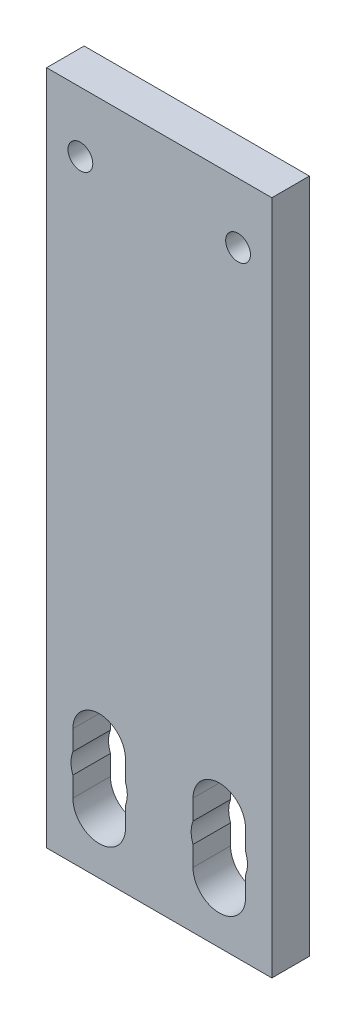
ISO-10303-21;
HEADER;
FILE_DESCRIPTION(('STEP AP214'),'2;1');
FILE_NAME('part.step','',(''),(''),'','','');
FILE_SCHEMA(('AUTOMOTIVE_DESIGN { 1 0 10303 214 1 1 1 1 }'));
ENDSEC;
DATA;
#1=APPLICATION_CONTEXT('core data for automotive mechanical design processes');
#2=APPLICATION_PROTOCOL_DEFINITION('international standard','automotive_design',2000,#1);
#3=PRODUCT_CONTEXT('',#1,'mechanical');
#4=PRODUCT('Part','Part','',(#3));
#5=PRODUCT_RELATED_PRODUCT_CATEGORY('part','',(#4));
#6=PRODUCT_DEFINITION_FORMATION('','',#4);
#7=PRODUCT_DEFINITION_CONTEXT('part definition',#1,'design');
#8=PRODUCT_DEFINITION('design','',#6,#7);
#9=PRODUCT_DEFINITION_SHAPE('','',#8);
#10=(LENGTH_UNIT() NAMED_UNIT(*) SI_UNIT(.MILLI.,.METRE.));
#11=(NAMED_UNIT(*) PLANE_ANGLE_UNIT() SI_UNIT($,.RADIAN.));
#12=(NAMED_UNIT(*) SI_UNIT($,.STERADIAN.) SOLID_ANGLE_UNIT());
#13=UNCERTAINTY_MEASURE_WITH_UNIT(LENGTH_MEASURE(1.E-05),#10,'distance_accuracy_value','');
#14=(GEOMETRIC_REPRESENTATION_CONTEXT(3) GLOBAL_UNCERTAINTY_ASSIGNED_CONTEXT((#13)) GLOBAL_UNIT_ASSIGNED_CONTEXT((#10,
#11,#12)) REPRESENTATION_CONTEXT('',''));
#15=CARTESIAN_POINT('',(0.,0.,0.));
#16=DIRECTION('',(0.,0.,1.));
#17=DIRECTION('',(1.,0.,0.));
#18=AXIS2_PLACEMENT_3D('',#15,#16,#17);
#19=CARTESIAN_POINT('',(0.,0.,2.5));
#20=DIRECTION('',(0.,0.,-1.));
#21=DIRECTION('',(-1.,0.,0.));
#22=AXIS2_PLACEMENT_3D('',#19,#20,#21);
#23=PLANE('',#22);
#24=CARTESIAN_POINT('',(-10.5,82.,2.5));
#25=DIRECTION('',(0.,0.,1.));
#26=DIRECTION('',(1.,0.,0.));
#27=AXIS2_PLACEMENT_3D('',#24,#25,#26);
#28=CIRCLE('',#27,1.65);
#29=CARTESIAN_POINT('',(-8.85,82.,2.5));
#30=VERTEX_POINT('',#29);
#31=EDGE_CURVE('E211',#30,#30,#28,.T.);
#32=ORIENTED_EDGE('',*,*,#31,.F.);
#33=EDGE_LOOP('',(#32));
#34=FACE_BOUND('',#33,.T.);
#35=DIRECTION('',(0.,-1.,0.));
#36=VECTOR('',#35,1.);
#37=CARTESIAN_POINT('',(11.5,0.,2.5));
#38=LINE('',#37,#36);
#39=CARTESIAN_POINT('',(11.5,10.1537087982164,2.5));
#40=VERTEX_POINT('',#39);
#41=CARTESIAN_POINT('',(11.5,7.5,2.5));
#42=VERTEX_POINT('',#41);
#43=EDGE_CURVE('E216',#40,#42,#38,.T.);
#44=ORIENTED_EDGE('',*,*,#43,.T.);
#45=CARTESIAN_POINT('',(8.,7.5,2.5));
#46=DIRECTION('',(0.,0.,-1.));
#47=DIRECTION('',(-1.,0.,0.));
#48=AXIS2_PLACEMENT_3D('',#45,#46,#47);
#49=CIRCLE('',#48,3.5);
#50=CARTESIAN_POINT('',(4.5,7.5,2.5));
#51=VERTEX_POINT('',#50);
#52=EDGE_CURVE('E185',#42,#51,#49,.T.);
#53=ORIENTED_EDGE('',*,*,#52,.T.);
#54=DIRECTION('',(0.,1.,0.));
#55=VECTOR('',#54,1.);
#56=CARTESIAN_POINT('',(4.5,0.,2.5));
#57=LINE('',#56,#55);
#58=CARTESIAN_POINT('',(4.5,10.1537087982164,2.5));
#59=VERTEX_POINT('',#58);
#60=EDGE_CURVE('E248',#51,#59,#57,.T.);
#61=ORIENTED_EDGE('',*,*,#60,.T.);
#62=CARTESIAN_POINT('',(8.,11.5,2.5));
#63=DIRECTION('',(0.,0.,-1.));
#64=DIRECTION('',(-1.,0.,0.));
#65=AXIS2_PLACEMENT_3D('',#62,#63,#64);
#66=CIRCLE('',#65,3.75);
#67=CARTESIAN_POINT('',(4.5,12.8462912017836,2.5));
#68=VERTEX_POINT('',#67);
#69=EDGE_CURVE('E245',#59,#68,#66,.T.);
#70=ORIENTED_EDGE('',*,*,#69,.T.);
#71=DIRECTION('',(0.,1.,0.));
#72=VECTOR('',#71,1.);
#73=CARTESIAN_POINT('',(4.5,0.,2.5));
#74=LINE('',#73,#72);
#75=CARTESIAN_POINT('',(4.5,15.5,2.5));
#76=VERTEX_POINT('',#75);
#77=EDGE_CURVE('E242',#68,#76,#74,.T.);
#78=ORIENTED_EDGE('',*,*,#77,.T.);
#79=CARTESIAN_POINT('',(8.,15.5,2.5));
#80=DIRECTION('',(0.,0.,-1.));
#81=DIRECTION('',(-1.,0.,0.));
#82=AXIS2_PLACEMENT_3D('',#79,#80,#81);
#83=CIRCLE('',#82,3.5);
#84=CARTESIAN_POINT('',(11.5,15.5,2.5));
#85=VERTEX_POINT('',#84);
#86=EDGE_CURVE('E239',#76,#85,#83,.T.);
#87=ORIENTED_EDGE('',*,*,#86,.T.);
#88=DIRECTION('',(0.,-1.,0.));
#89=VECTOR('',#88,1.);
#90=CARTESIAN_POINT('',(11.5,0.,2.5));
#91=LINE('',#90,#89);
#92=CARTESIAN_POINT('',(11.5,12.8462912017836,2.5));
#93=VERTEX_POINT('',#92);
#94=EDGE_CURVE('E236',#85,#93,#91,.T.);
#95=ORIENTED_EDGE('',*,*,#94,.T.);
#96=CARTESIAN_POINT('',(8.,11.5,2.5));
#97=DIRECTION('',(0.,0.,-1.));
#98=DIRECTION('',(-1.,0.,0.));
#99=AXIS2_PLACEMENT_3D('',#96,#97,#98);
#100=CIRCLE('',#99,3.75);
#101=EDGE_CURVE('E233',#93,#40,#100,.T.);
#102=ORIENTED_EDGE('',*,*,#101,.T.);
#103=EDGE_LOOP('',(#44,#53,#61,#70,#78,#87,#95,#102));
#104=FACE_BOUND('',#103,.T.);
#105=DIRECTION('',(0.,1.,0.));
#106=VECTOR('',#105,1.);
#107=CARTESIAN_POINT('',(-11.5,0.,2.5));
#108=LINE('',#107,#106);
#109=CARTESIAN_POINT('',(-11.5,12.8462912017836,2.5));
#110=VERTEX_POINT('',#109);
#111=CARTESIAN_POINT('',(-11.5,15.5,2.5));
#112=VERTEX_POINT('',#111);
#113=EDGE_CURVE('E256',#110,#112,#108,.T.);
#114=ORIENTED_EDGE('',*,*,#113,.T.);
#115=CARTESIAN_POINT('',(-8.,15.5,2.5));
#116=DIRECTION('',(0.,0.,-1.));
#117=DIRECTION('',(-1.,0.,0.));
#118=AXIS2_PLACEMENT_3D('',#115,#116,#117);
#119=CIRCLE('',#118,3.5);
#120=CARTESIAN_POINT('',(-4.5,15.5,2.5));
#121=VERTEX_POINT('',#120);
#122=EDGE_CURVE('E296',#112,#121,#119,.T.);
#123=ORIENTED_EDGE('',*,*,#122,.T.);
#124=DIRECTION('',(0.,-1.,0.));
#125=VECTOR('',#124,1.);
#126=CARTESIAN_POINT('',(-4.5,0.,2.5));
#127=LINE('',#126,#125);
#128=CARTESIAN_POINT('',(-4.5,12.8462912017836,2.5));
#129=VERTEX_POINT('',#128);
#130=EDGE_CURVE('E293',#121,#129,#127,.T.);
#131=ORIENTED_EDGE('',*,*,#130,.T.);
#132=CARTESIAN_POINT('',(-8.,11.5,2.5));
#133=DIRECTION('',(0.,0.,-1.));
#134=DIRECTION('',(-1.,0.,0.));
#135=AXIS2_PLACEMENT_3D('',#132,#133,#134);
#136=CIRCLE('',#135,3.75);
#137=CARTESIAN_POINT('',(-4.5,10.1537087982164,2.5));
#138=VERTEX_POINT('',#137);
#139=EDGE_CURVE('E290',#129,#138,#136,.T.);
#140=ORIENTED_EDGE('',*,*,#139,.T.);
#141=DIRECTION('',(0.,-1.,0.));
#142=VECTOR('',#141,1.);
#143=CARTESIAN_POINT('',(-4.5,0.,2.5));
#144=LINE('',#143,#142);
#145=CARTESIAN_POINT('',(-4.5,7.5,2.5));
#146=VERTEX_POINT('',#145);
#147=EDGE_CURVE('E287',#138,#146,#144,.T.);
#148=ORIENTED_EDGE('',*,*,#147,.T.);
#149=CARTESIAN_POINT('',(-8.,7.5,2.5));
#150=DIRECTION('',(0.,0.,-1.));
#151=DIRECTION('',(-1.,0.,0.));
#152=AXIS2_PLACEMENT_3D('',#149,#150,#151);
#153=CIRCLE('',#152,3.5);
#154=CARTESIAN_POINT('',(-11.5,7.5,2.5));
#155=VERTEX_POINT('',#154);
#156=EDGE_CURVE('E284',#146,#155,#153,.T.);
#157=ORIENTED_EDGE('',*,*,#156,.T.);
#158=DIRECTION('',(0.,1.,0.));
#159=VECTOR('',#158,1.);
#160=CARTESIAN_POINT('',(-11.5,0.,2.5));
#161=LINE('',#160,#159);
#162=CARTESIAN_POINT('',(-11.5,10.1537087982164,2.5));
#163=VERTEX_POINT('',#162);
#164=EDGE_CURVE('E281',#155,#163,#161,.T.);
#165=ORIENTED_EDGE('',*,*,#164,.T.);
#166=CARTESIAN_POINT('',(-8.,11.5,2.5));
#167=DIRECTION('',(0.,0.,-1.));
#168=DIRECTION('',(-1.,0.,0.));
#169=AXIS2_PLACEMENT_3D('',#166,#167,#168);
#170=CIRCLE('',#169,3.75);
#171=EDGE_CURVE('E278',#163,#110,#170,.T.);
#172=ORIENTED_EDGE('',*,*,#171,.T.);
#173=EDGE_LOOP('',(#114,#123,#131,#140,#148,#157,#165,#172));
#174=FACE_BOUND('',#173,.T.);
#175=DIRECTION('',(0.,-1.,0.));
#176=VECTOR('',#175,1.);
#177=CARTESIAN_POINT('',(-15.,0.,2.5));
#178=LINE('',#177,#176);
#179=CARTESIAN_POINT('',(-15.,90.,2.5));
#180=VERTEX_POINT('',#179);
#181=CARTESIAN_POINT('',(-15.,0.,2.5));
#182=VERTEX_POINT('',#181);
#183=EDGE_CURVE('E300',#180,#182,#178,.T.);
#184=ORIENTED_EDGE('',*,*,#183,.T.);
#185=DIRECTION('',(1.,0.,0.));
#186=VECTOR('',#185,1.);
#187=CARTESIAN_POINT('',(-15.,0.,2.5));
#188=LINE('',#187,#186);
#189=CARTESIAN_POINT('',(15.,0.,2.5));
#190=VERTEX_POINT('',#189);
#191=EDGE_CURVE('E303',#182,#190,#188,.T.);
#192=ORIENTED_EDGE('',*,*,#191,.T.);
#193=DIRECTION('',(0.,1.,0.));
#194=VECTOR('',#193,1.);
#195=CARTESIAN_POINT('',(15.,0.,2.5));
#196=LINE('',#195,#194);
#197=CARTESIAN_POINT('',(15.,90.,2.5));
#198=VERTEX_POINT('',#197);
#199=EDGE_CURVE('E306',#190,#198,#196,.T.);
#200=ORIENTED_EDGE('',*,*,#199,.T.);
#201=DIRECTION('',(-1.,0.,0.));
#202=VECTOR('',#201,1.);
#203=CARTESIAN_POINT('',(-15.,90.,2.5));
#204=LINE('',#203,#202);
#205=EDGE_CURVE('E308',#198,#180,#204,.T.);
#206=ORIENTED_EDGE('',*,*,#205,.T.);
#207=EDGE_LOOP('',(#184,#192,#200,#206));
#208=FACE_BOUND('',#207,.T.);
#209=CARTESIAN_POINT('',(10.5,82.,2.5));
#210=DIRECTION('',(0.,0.,1.));
#211=DIRECTION('',(1.,0.,0.));
#212=AXIS2_PLACEMENT_3D('',#209,#210,#211);
#213=CIRCLE('',#212,1.65);
#214=CARTESIAN_POINT('',(12.15,82.,2.5));
#215=VERTEX_POINT('',#214);
#216=EDGE_CURVE('E203',#215,#215,#213,.T.);
#217=ORIENTED_EDGE('',*,*,#216,.F.);
#218=EDGE_LOOP('',(#217));
#219=FACE_BOUND('',#218,.T.);
#220=ADVANCED_FACE('F37',(#34,#104,#174,#208,#219),#23,.F.);
#221=CARTESIAN_POINT('',(-15.,0.,2.5));
#222=DIRECTION('',(1.,0.,0.));
#223=DIRECTION('',(0.,0.,-1.));
#224=AXIS2_PLACEMENT_3D('',#221,#222,#223);
#225=PLANE('',#224);
#226=DIRECTION('',(0.,-1.,0.));
#227=VECTOR('',#226,1.);
#228=CARTESIAN_POINT('',(-15.,0.,-2.5));
#229=LINE('',#228,#227);
#230=CARTESIAN_POINT('',(-15.,90.,-2.5));
#231=VERTEX_POINT('',#230);
#232=CARTESIAN_POINT('',(-15.,0.,-2.5));
#233=VERTEX_POINT('',#232);
#234=EDGE_CURVE('E299',#231,#233,#229,.T.);
#235=ORIENTED_EDGE('',*,*,#234,.T.);
#236=DIRECTION('',(0.,0.,-1.));
#237=VECTOR('',#236,1.);
#238=CARTESIAN_POINT('',(-15.,0.,2.5));
#239=LINE('',#238,#237);
#240=EDGE_CURVE('E326',#182,#233,#239,.T.);
#241=ORIENTED_EDGE('',*,*,#240,.F.);
#242=ORIENTED_EDGE('',*,*,#183,.F.);
#243=DIRECTION('',(0.,0.,-1.));
#244=VECTOR('',#243,1.);
#245=CARTESIAN_POINT('',(-15.,90.,2.5));
#246=LINE('',#245,#244);
#247=EDGE_CURVE('E310',#180,#231,#246,.T.);
#248=ORIENTED_EDGE('',*,*,#247,.T.);
#249=EDGE_LOOP('',(#235,#241,#242,#248));
#250=FACE_BOUND('',#249,.T.);
#251=ADVANCED_FACE('F39',(#250),#225,.F.);
#252=CARTESIAN_POINT('',(-15.,0.,2.5));
#253=DIRECTION('',(0.,1.,0.));
#254=DIRECTION('',(0.,0.,1.));
#255=AXIS2_PLACEMENT_3D('',#252,#253,#254);
#256=PLANE('',#255);
#257=DIRECTION('',(1.,0.,0.));
#258=VECTOR('',#257,1.);
#259=CARTESIAN_POINT('',(-15.,0.,-2.5));
#260=LINE('',#259,#258);
#261=CARTESIAN_POINT('',(15.,0.,-2.5));
#262=VERTEX_POINT('',#261);
#263=EDGE_CURVE('E313',#233,#262,#260,.T.);
#264=ORIENTED_EDGE('',*,*,#263,.T.);
#265=DIRECTION('',(0.,0.,-1.));
#266=VECTOR('',#265,1.);
#267=CARTESIAN_POINT('',(15.,0.,2.5));
#268=LINE('',#267,#266);
#269=EDGE_CURVE('E323',#190,#262,#268,.T.);
#270=ORIENTED_EDGE('',*,*,#269,.F.);
#271=ORIENTED_EDGE('',*,*,#191,.F.);
#272=ORIENTED_EDGE('',*,*,#240,.T.);
#273=EDGE_LOOP('',(#264,#270,#271,#272));
#274=FACE_BOUND('',#273,.T.);
#275=ADVANCED_FACE('F384',(#274),#256,.F.);
#276=CARTESIAN_POINT('',(15.,0.,2.5));
#277=DIRECTION('',(-1.,0.,0.));
#278=DIRECTION('',(0.,0.,1.));
#279=AXIS2_PLACEMENT_3D('',#276,#277,#278);
#280=PLANE('',#279);
#281=DIRECTION('',(0.,1.,0.));
#282=VECTOR('',#281,1.);
#283=CARTESIAN_POINT('',(15.,0.,-2.5));
#284=LINE('',#283,#282);
#285=CARTESIAN_POINT('',(15.,90.,-2.5));
#286=VERTEX_POINT('',#285);
#287=EDGE_CURVE('E315',#262,#286,#284,.T.);
#288=ORIENTED_EDGE('',*,*,#287,.T.);
#289=DIRECTION('',(0.,0.,-1.));
#290=VECTOR('',#289,1.);
#291=CARTESIAN_POINT('',(15.,90.,2.5));
#292=LINE('',#291,#290);
#293=EDGE_CURVE('E320',#198,#286,#292,.T.);
#294=ORIENTED_EDGE('',*,*,#293,.F.);
#295=ORIENTED_EDGE('',*,*,#199,.F.);
#296=ORIENTED_EDGE('',*,*,#269,.T.);
#297=EDGE_LOOP('',(#288,#294,#295,#296));
#298=FACE_BOUND('',#297,.T.);
#299=ADVANCED_FACE('F397',(#298),#280,.F.);
#300=CARTESIAN_POINT('',(-15.,90.,2.5));
#301=DIRECTION('',(0.,-1.,0.));
#302=DIRECTION('',(0.,0.,-1.));
#303=AXIS2_PLACEMENT_3D('',#300,#301,#302);
#304=PLANE('',#303);
#305=DIRECTION('',(-1.,0.,0.));
#306=VECTOR('',#305,1.);
#307=CARTESIAN_POINT('',(-15.,90.,-2.5));
#308=LINE('',#307,#306);
#309=EDGE_CURVE('E304',#286,#231,#308,.T.);
#310=ORIENTED_EDGE('',*,*,#309,.T.);
#311=ORIENTED_EDGE('',*,*,#247,.F.);
#312=ORIENTED_EDGE('',*,*,#205,.F.);
#313=ORIENTED_EDGE('',*,*,#293,.T.);
#314=EDGE_LOOP('',(#310,#311,#312,#313));
#315=FACE_BOUND('',#314,.T.);
#316=ADVANCED_FACE('F393',(#315),#304,.F.);
#317=CARTESIAN_POINT('',(0.,0.,-2.5));
#318=DIRECTION('',(0.,0.,-1.));
#319=DIRECTION('',(-1.,0.,0.));
#320=AXIS2_PLACEMENT_3D('',#317,#318,#319);
#321=PLANE('',#320);
#322=CARTESIAN_POINT('',(-10.5,82.,-2.5));
#323=DIRECTION('',(0.,0.,-1.));
#324=DIRECTION('',(-1.,0.,0.));
#325=AXIS2_PLACEMENT_3D('',#322,#323,#324);
#326=CIRCLE('',#325,1.65);
#327=CARTESIAN_POINT('',(-12.15,82.,-2.5));
#328=VERTEX_POINT('',#327);
#329=EDGE_CURVE('E41',#328,#328,#326,.T.);
#330=ORIENTED_EDGE('',*,*,#329,.F.);
#331=EDGE_LOOP('',(#330));
#332=FACE_BOUND('',#331,.T.);
#333=CARTESIAN_POINT('',(10.5,82.,-2.5));
#334=DIRECTION('',(0.,0.,-1.));
#335=DIRECTION('',(-1.,0.,0.));
#336=AXIS2_PLACEMENT_3D('',#333,#334,#335);
#337=CIRCLE('',#336,1.65);
#338=CARTESIAN_POINT('',(8.85,82.,-2.5));
#339=VERTEX_POINT('',#338);
#340=EDGE_CURVE('E187',#339,#339,#337,.T.);
#341=ORIENTED_EDGE('',*,*,#340,.F.);
#342=EDGE_LOOP('',(#341));
#343=FACE_BOUND('',#342,.T.);
#344=CARTESIAN_POINT('',(8.,7.5,-2.5));
#345=DIRECTION('',(0.,0.,-1.));
#346=DIRECTION('',(-1.,0.,0.));
#347=AXIS2_PLACEMENT_3D('',#344,#345,#346);
#348=CIRCLE('',#347,3.5);
#349=CARTESIAN_POINT('',(11.5,7.5,-2.5));
#350=VERTEX_POINT('',#349);
#351=CARTESIAN_POINT('',(4.5,7.5,-2.5));
#352=VERTEX_POINT('',#351);
#353=EDGE_CURVE('E11',#350,#352,#348,.T.);
#354=ORIENTED_EDGE('',*,*,#353,.F.);
#355=DIRECTION('',(0.,-1.,0.));
#356=VECTOR('',#355,1.);
#357=CARTESIAN_POINT('',(11.5,0.,-2.5));
#358=LINE('',#357,#356);
#359=CARTESIAN_POINT('',(11.5,10.1537087982164,-2.5));
#360=VERTEX_POINT('',#359);
#361=EDGE_CURVE('E172',#360,#350,#358,.T.);
#362=ORIENTED_EDGE('',*,*,#361,.F.);
#363=CARTESIAN_POINT('',(8.,11.5,-2.5));
#364=DIRECTION('',(0.,0.,-1.));
#365=DIRECTION('',(-1.,0.,0.));
#366=AXIS2_PLACEMENT_3D('',#363,#364,#365);
#367=CIRCLE('',#366,3.75);
#368=CARTESIAN_POINT('',(11.5,12.8462912017836,-2.5));
#369=VERTEX_POINT('',#368);
#370=EDGE_CURVE('E177',#369,#360,#367,.T.);
#371=ORIENTED_EDGE('',*,*,#370,.F.);
#372=DIRECTION('',(0.,-1.,0.));
#373=VECTOR('',#372,1.);
#374=CARTESIAN_POINT('',(11.5,0.,-2.5));
#375=LINE('',#374,#373);
#376=CARTESIAN_POINT('',(11.5,15.5,-2.5));
#377=VERTEX_POINT('',#376);
#378=EDGE_CURVE('E346',#377,#369,#375,.T.);
#379=ORIENTED_EDGE('',*,*,#378,.F.);
#380=CARTESIAN_POINT('',(8.,15.5,-2.5));
#381=DIRECTION('',(0.,0.,-1.));
#382=DIRECTION('',(-1.,0.,0.));
#383=AXIS2_PLACEMENT_3D('',#380,#381,#382);
#384=CIRCLE('',#383,3.5);
#385=CARTESIAN_POINT('',(4.5,15.5,-2.5));
#386=VERTEX_POINT('',#385);
#387=EDGE_CURVE('E348',#386,#377,#384,.T.);
#388=ORIENTED_EDGE('',*,*,#387,.F.);
#389=DIRECTION('',(0.,1.,0.));
#390=VECTOR('',#389,1.);
#391=CARTESIAN_POINT('',(4.5,0.,-2.5));
#392=LINE('',#391,#390);
#393=CARTESIAN_POINT('',(4.5,12.8462912017836,-2.5));
#394=VERTEX_POINT('',#393);
#395=EDGE_CURVE('E199',#394,#386,#392,.T.);
#396=ORIENTED_EDGE('',*,*,#395,.F.);
#397=CARTESIAN_POINT('',(8.,11.5,-2.5));
#398=DIRECTION('',(0.,0.,-1.));
#399=DIRECTION('',(-1.,0.,0.));
#400=AXIS2_PLACEMENT_3D('',#397,#398,#399);
#401=CIRCLE('',#400,3.75);
#402=CARTESIAN_POINT('',(4.5,10.1537087982164,-2.5));
#403=VERTEX_POINT('',#402);
#404=EDGE_CURVE('E194',#403,#394,#401,.T.);
#405=ORIENTED_EDGE('',*,*,#404,.F.);
#406=DIRECTION('',(0.,1.,0.));
#407=VECTOR('',#406,1.);
#408=CARTESIAN_POINT('',(4.5,0.,-2.5));
#409=LINE('',#408,#407);
#410=EDGE_CURVE('E46',#352,#403,#409,.T.);
#411=ORIENTED_EDGE('',*,*,#410,.F.);
#412=EDGE_LOOP('',(#354,#362,#371,#379,#388,#396,#405,#411));
#413=FACE_BOUND('',#412,.T.);
#414=CARTESIAN_POINT('',(-8.,15.5,-2.5));
#415=DIRECTION('',(0.,0.,-1.));
#416=DIRECTION('',(-1.,0.,0.));
#417=AXIS2_PLACEMENT_3D('',#414,#415,#416);
#418=CIRCLE('',#417,3.5);
#419=CARTESIAN_POINT('',(-11.5,15.5,-2.5));
#420=VERTEX_POINT('',#419);
#421=CARTESIAN_POINT('',(-4.5,15.5,-2.5));
#422=VERTEX_POINT('',#421);
#423=EDGE_CURVE('E178',#420,#422,#418,.T.);
#424=ORIENTED_EDGE('',*,*,#423,.F.);
#425=DIRECTION('',(0.,1.,0.));
#426=VECTOR('',#425,1.);
#427=CARTESIAN_POINT('',(-11.5,0.,-2.5));
#428=LINE('',#427,#426);
#429=CARTESIAN_POINT('',(-11.5,12.8462912017836,-2.5));
#430=VERTEX_POINT('',#429);
#431=EDGE_CURVE('E329',#430,#420,#428,.T.);
#432=ORIENTED_EDGE('',*,*,#431,.F.);
#433=CARTESIAN_POINT('',(-8.,11.5,-2.5));
#434=DIRECTION('',(0.,0.,-1.));
#435=DIRECTION('',(-1.,0.,0.));
#436=AXIS2_PLACEMENT_3D('',#433,#434,#435);
#437=CIRCLE('',#436,3.75);
#438=CARTESIAN_POINT('',(-11.5,10.1537087982164,-2.5));
#439=VERTEX_POINT('',#438);
#440=EDGE_CURVE('E331',#439,#430,#437,.T.);
#441=ORIENTED_EDGE('',*,*,#440,.F.);
#442=DIRECTION('',(0.,1.,0.));
#443=VECTOR('',#442,1.);
#444=CARTESIAN_POINT('',(-11.5,0.,-2.5));
#445=LINE('',#444,#443);
#446=CARTESIAN_POINT('',(-11.5,7.5,-2.5));
#447=VERTEX_POINT('',#446);
#448=EDGE_CURVE('E334',#447,#439,#445,.T.);
#449=ORIENTED_EDGE('',*,*,#448,.F.);
#450=CARTESIAN_POINT('',(-8.,7.5,-2.5));
#451=DIRECTION('',(0.,0.,-1.));
#452=DIRECTION('',(-1.,0.,0.));
#453=AXIS2_PLACEMENT_3D('',#450,#451,#452);
#454=CIRCLE('',#453,3.5);
#455=CARTESIAN_POINT('',(-4.5,7.5,-2.5));
#456=VERTEX_POINT('',#455);
#457=EDGE_CURVE('E336',#456,#447,#454,.T.);
#458=ORIENTED_EDGE('',*,*,#457,.F.);
#459=DIRECTION('',(0.,-1.,0.));
#460=VECTOR('',#459,1.);
#461=CARTESIAN_POINT('',(-4.5,0.,-2.5));
#462=LINE('',#461,#460);
#463=CARTESIAN_POINT('',(-4.5,10.1537087982164,-2.5));
#464=VERTEX_POINT('',#463);
#465=EDGE_CURVE('E338',#464,#456,#462,.T.);
#466=ORIENTED_EDGE('',*,*,#465,.F.);
#467=CARTESIAN_POINT('',(-8.,11.5,-2.5));
#468=DIRECTION('',(0.,0.,-1.));
#469=DIRECTION('',(-1.,0.,0.));
#470=AXIS2_PLACEMENT_3D('',#467,#468,#469);
#471=CIRCLE('',#470,3.75);
#472=CARTESIAN_POINT('',(-4.5,12.8462912017836,-2.5));
#473=VERTEX_POINT('',#472);
#474=EDGE_CURVE('E340',#473,#464,#471,.T.);
#475=ORIENTED_EDGE('',*,*,#474,.F.);
#476=DIRECTION('',(0.,-1.,0.));
#477=VECTOR('',#476,1.);
#478=CARTESIAN_POINT('',(-4.5,0.,-2.5));
#479=LINE('',#478,#477);
#480=EDGE_CURVE('E342',#422,#473,#479,.T.);
#481=ORIENTED_EDGE('',*,*,#480,.F.);
#482=EDGE_LOOP('',(#424,#432,#441,#449,#458,#466,#475,#481));
#483=FACE_BOUND('',#482,.T.);
#484=ORIENTED_EDGE('',*,*,#234,.F.);
#485=ORIENTED_EDGE('',*,*,#309,.F.);
#486=ORIENTED_EDGE('',*,*,#287,.F.);
#487=ORIENTED_EDGE('',*,*,#263,.F.);
#488=EDGE_LOOP('',(#484,#485,#486,#487));
#489=FACE_BOUND('',#488,.T.);
#490=ADVANCED_FACE('F190',(#332,#343,#413,#483,#489),#321,.T.);
#491=CARTESIAN_POINT('',(-8.,15.5,-5.));
#492=DIRECTION('',(0.,0.,1.));
#493=DIRECTION('',(1.,0.,0.));
#494=AXIS2_PLACEMENT_3D('',#491,#492,#493);
#495=CYLINDRICAL_SURFACE('',#494,3.5);
#496=DIRECTION('',(0.,0.,1.));
#497=VECTOR('',#496,1.);
#498=CARTESIAN_POINT('',(-11.5,15.5,-5.));
#499=LINE('',#498,#497);
#500=EDGE_CURVE('E252',#420,#112,#499,.T.);
#501=ORIENTED_EDGE('',*,*,#500,.F.);
#502=ORIENTED_EDGE('',*,*,#423,.T.);
#503=DIRECTION('',(0.,0.,1.));
#504=VECTOR('',#503,1.);
#505=CARTESIAN_POINT('',(-4.5,15.5,-5.));
#506=LINE('',#505,#504);
#507=EDGE_CURVE('E253',#422,#121,#506,.T.);
#508=ORIENTED_EDGE('',*,*,#507,.T.);
#509=ORIENTED_EDGE('',*,*,#122,.F.);
#510=EDGE_LOOP('',(#501,#502,#508,#509));
#511=FACE_BOUND('',#510,.T.);
#512=ADVANCED_FACE('F389',(#511),#495,.F.);
#513=CARTESIAN_POINT('',(-4.5,12.8462912017836,-5.));
#514=DIRECTION('',(1.,0.,0.));
#515=DIRECTION('',(0.,0.,-1.));
#516=AXIS2_PLACEMENT_3D('',#513,#514,#515);
#517=PLANE('',#516);
#518=ORIENTED_EDGE('',*,*,#507,.F.);
#519=ORIENTED_EDGE('',*,*,#480,.T.);
#520=DIRECTION('',(0.,0.,1.));
#521=VECTOR('',#520,1.);
#522=CARTESIAN_POINT('',(-4.5,12.8462912017836,-5.));
#523=LINE('',#522,#521);
#524=EDGE_CURVE('E257',#473,#129,#523,.T.);
#525=ORIENTED_EDGE('',*,*,#524,.T.);
#526=ORIENTED_EDGE('',*,*,#130,.F.);
#527=EDGE_LOOP('',(#518,#519,#525,#526));
#528=FACE_BOUND('',#527,.T.);
#529=ADVANCED_FACE('F439',(#528),#517,.F.);
#530=CARTESIAN_POINT('',(-8.,11.5,-5.));
#531=DIRECTION('',(0.,0.,1.));
#532=DIRECTION('',(1.,0.,0.));
#533=AXIS2_PLACEMENT_3D('',#530,#531,#532);
#534=CYLINDRICAL_SURFACE('',#533,3.75);
#535=ORIENTED_EDGE('',*,*,#524,.F.);
#536=ORIENTED_EDGE('',*,*,#474,.T.);
#537=DIRECTION('',(0.,0.,1.));
#538=VECTOR('',#537,1.);
#539=CARTESIAN_POINT('',(-4.5,10.1537087982164,-5.));
#540=LINE('',#539,#538);
#541=EDGE_CURVE('E260',#464,#138,#540,.T.);
#542=ORIENTED_EDGE('',*,*,#541,.T.);
#543=ORIENTED_EDGE('',*,*,#139,.F.);
#544=EDGE_LOOP('',(#535,#536,#542,#543));
#545=FACE_BOUND('',#544,.T.);
#546=ADVANCED_FACE('F446',(#545),#534,.F.);
#547=CARTESIAN_POINT('',(-4.5,7.5,-5.));
#548=DIRECTION('',(1.,0.,0.));
#549=DIRECTION('',(0.,0.,-1.));
#550=AXIS2_PLACEMENT_3D('',#547,#548,#549);
#551=PLANE('',#550);
#552=ORIENTED_EDGE('',*,*,#541,.F.);
#553=ORIENTED_EDGE('',*,*,#465,.T.);
#554=DIRECTION('',(0.,0.,1.));
#555=VECTOR('',#554,1.);
#556=CARTESIAN_POINT('',(-4.5,7.5,-5.));
#557=LINE('',#556,#555);
#558=EDGE_CURVE('E263',#456,#146,#557,.T.);
#559=ORIENTED_EDGE('',*,*,#558,.T.);
#560=ORIENTED_EDGE('',*,*,#147,.F.);
#561=EDGE_LOOP('',(#552,#553,#559,#560));
#562=FACE_BOUND('',#561,.T.);
#563=ADVANCED_FACE('F454',(#562),#551,.F.);
#564=CARTESIAN_POINT('',(-8.,7.5,-5.));
#565=DIRECTION('',(0.,0.,1.));
#566=DIRECTION('',(1.,0.,0.));
#567=AXIS2_PLACEMENT_3D('',#564,#565,#566);
#568=CYLINDRICAL_SURFACE('',#567,3.5);
#569=ORIENTED_EDGE('',*,*,#558,.F.);
#570=ORIENTED_EDGE('',*,*,#457,.T.);
#571=DIRECTION('',(0.,0.,1.));
#572=VECTOR('',#571,1.);
#573=CARTESIAN_POINT('',(-11.5,7.5,-5.));
#574=LINE('',#573,#572);
#575=EDGE_CURVE('E266',#447,#155,#574,.T.);
#576=ORIENTED_EDGE('',*,*,#575,.T.);
#577=ORIENTED_EDGE('',*,*,#156,.F.);
#578=EDGE_LOOP('',(#569,#570,#576,#577));
#579=FACE_BOUND('',#578,.T.);
#580=ADVANCED_FACE('F462',(#579),#568,.F.);
#581=CARTESIAN_POINT('',(-11.5,7.5,-5.));
#582=DIRECTION('',(-1.,0.,0.));
#583=DIRECTION('',(0.,0.,1.));
#584=AXIS2_PLACEMENT_3D('',#581,#582,#583);
#585=PLANE('',#584);
#586=ORIENTED_EDGE('',*,*,#575,.F.);
#587=ORIENTED_EDGE('',*,*,#448,.T.);
#588=DIRECTION('',(0.,0.,1.));
#589=VECTOR('',#588,1.);
#590=CARTESIAN_POINT('',(-11.5,10.1537087982164,-5.));
#591=LINE('',#590,#589);
#592=EDGE_CURVE('E269',#439,#163,#591,.T.);
#593=ORIENTED_EDGE('',*,*,#592,.T.);
#594=ORIENTED_EDGE('',*,*,#164,.F.);
#595=EDGE_LOOP('',(#586,#587,#593,#594));
#596=FACE_BOUND('',#595,.T.);
#597=ADVANCED_FACE('F470',(#596),#585,.F.);
#598=CARTESIAN_POINT('',(-8.,11.5,-5.));
#599=DIRECTION('',(0.,0.,1.));
#600=DIRECTION('',(1.,0.,0.));
#601=AXIS2_PLACEMENT_3D('',#598,#599,#600);
#602=CYLINDRICAL_SURFACE('',#601,3.75);
#603=ORIENTED_EDGE('',*,*,#592,.F.);
#604=ORIENTED_EDGE('',*,*,#440,.T.);
#605=DIRECTION('',(0.,0.,1.));
#606=VECTOR('',#605,1.);
#607=CARTESIAN_POINT('',(-11.5,12.8462912017836,-5.));
#608=LINE('',#607,#606);
#609=EDGE_CURVE('E272',#430,#110,#608,.T.);
#610=ORIENTED_EDGE('',*,*,#609,.T.);
#611=ORIENTED_EDGE('',*,*,#171,.F.);
#612=EDGE_LOOP('',(#603,#604,#610,#611));
#613=FACE_BOUND('',#612,.T.);
#614=ADVANCED_FACE('F478',(#613),#602,.F.);
#615=CARTESIAN_POINT('',(-11.5,12.8462912017836,-5.));
#616=DIRECTION('',(-1.,0.,0.));
#617=DIRECTION('',(0.,0.,1.));
#618=AXIS2_PLACEMENT_3D('',#615,#616,#617);
#619=PLANE('',#618);
#620=ORIENTED_EDGE('',*,*,#609,.F.);
#621=ORIENTED_EDGE('',*,*,#431,.T.);
#622=ORIENTED_EDGE('',*,*,#500,.T.);
#623=ORIENTED_EDGE('',*,*,#113,.F.);
#624=EDGE_LOOP('',(#620,#621,#622,#623));
#625=FACE_BOUND('',#624,.T.);
#626=ADVANCED_FACE('F375',(#625),#619,.F.);
#627=CARTESIAN_POINT('',(8.,7.5,-5.));
#628=DIRECTION('',(0.,0.,1.));
#629=DIRECTION('',(1.,0.,0.));
#630=AXIS2_PLACEMENT_3D('',#627,#628,#629);
#631=CYLINDRICAL_SURFACE('',#630,3.5);
#632=DIRECTION('',(0.,0.,1.));
#633=VECTOR('',#632,1.);
#634=CARTESIAN_POINT('',(11.5,7.5,-5.));
#635=LINE('',#634,#633);
#636=EDGE_CURVE('E54',#350,#42,#635,.T.);
#637=ORIENTED_EDGE('',*,*,#636,.F.);
#638=ORIENTED_EDGE('',*,*,#353,.T.);
#639=DIRECTION('',(0.,0.,1.));
#640=VECTOR('',#639,1.);
#641=CARTESIAN_POINT('',(4.5,7.5,-5.));
#642=LINE('',#641,#640);
#643=EDGE_CURVE('E214',#352,#51,#642,.T.);
#644=ORIENTED_EDGE('',*,*,#643,.T.);
#645=ORIENTED_EDGE('',*,*,#52,.F.);
#646=EDGE_LOOP('',(#637,#638,#644,#645));
#647=FACE_BOUND('',#646,.T.);
#648=ADVANCED_FACE('F181',(#647),#631,.F.);
#649=CARTESIAN_POINT('',(4.5,7.5,-5.));
#650=DIRECTION('',(-1.,0.,0.));
#651=DIRECTION('',(0.,0.,1.));
#652=AXIS2_PLACEMENT_3D('',#649,#650,#651);
#653=PLANE('',#652);
#654=ORIENTED_EDGE('',*,*,#643,.F.);
#655=ORIENTED_EDGE('',*,*,#410,.T.);
#656=DIRECTION('',(0.,0.,1.));
#657=VECTOR('',#656,1.);
#658=CARTESIAN_POINT('',(4.5,10.1537087982164,-5.));
#659=LINE('',#658,#657);
#660=EDGE_CURVE('E217',#403,#59,#659,.T.);
#661=ORIENTED_EDGE('',*,*,#660,.T.);
#662=ORIENTED_EDGE('',*,*,#60,.F.);
#663=EDGE_LOOP('',(#654,#655,#661,#662));
#664=FACE_BOUND('',#663,.T.);
#665=ADVANCED_FACE('F367',(#664),#653,.F.);
#666=CARTESIAN_POINT('',(8.,11.5,-5.));
#667=DIRECTION('',(0.,0.,1.));
#668=DIRECTION('',(1.,0.,0.));
#669=AXIS2_PLACEMENT_3D('',#666,#667,#668);
#670=CYLINDRICAL_SURFACE('',#669,3.75);
#671=ORIENTED_EDGE('',*,*,#660,.F.);
#672=ORIENTED_EDGE('',*,*,#404,.T.);
#673=DIRECTION('',(0.,0.,1.));
#674=VECTOR('',#673,1.);
#675=CARTESIAN_POINT('',(4.5,12.8462912017836,-5.));
#676=LINE('',#675,#674);
#677=EDGE_CURVE('E219',#394,#68,#676,.T.);
#678=ORIENTED_EDGE('',*,*,#677,.T.);
#679=ORIENTED_EDGE('',*,*,#69,.F.);
#680=EDGE_LOOP('',(#671,#672,#678,#679));
#681=FACE_BOUND('',#680,.T.);
#682=ADVANCED_FACE('F366',(#681),#670,.F.);
#683=CARTESIAN_POINT('',(4.5,12.8462912017836,-5.));
#684=DIRECTION('',(-1.,0.,0.));
#685=DIRECTION('',(0.,0.,1.));
#686=AXIS2_PLACEMENT_3D('',#683,#684,#685);
#687=PLANE('',#686);
#688=ORIENTED_EDGE('',*,*,#677,.F.);
#689=ORIENTED_EDGE('',*,*,#395,.T.);
#690=DIRECTION('',(0.,0.,1.));
#691=VECTOR('',#690,1.);
#692=CARTESIAN_POINT('',(4.5,15.5,-5.));
#693=LINE('',#692,#691);
#694=EDGE_CURVE('E222',#386,#76,#693,.T.);
#695=ORIENTED_EDGE('',*,*,#694,.T.);
#696=ORIENTED_EDGE('',*,*,#77,.F.);
#697=EDGE_LOOP('',(#688,#689,#695,#696));
#698=FACE_BOUND('',#697,.T.);
#699=ADVANCED_FACE('F352',(#698),#687,.F.);
#700=CARTESIAN_POINT('',(8.,15.5,-5.));
#701=DIRECTION('',(0.,0.,1.));
#702=DIRECTION('',(1.,0.,0.));
#703=AXIS2_PLACEMENT_3D('',#700,#701,#702);
#704=CYLINDRICAL_SURFACE('',#703,3.5);
#705=ORIENTED_EDGE('',*,*,#694,.F.);
#706=ORIENTED_EDGE('',*,*,#387,.T.);
#707=DIRECTION('',(0.,0.,1.));
#708=VECTOR('',#707,1.);
#709=CARTESIAN_POINT('',(11.5,15.5,-5.));
#710=LINE('',#709,#708);
#711=EDGE_CURVE('E225',#377,#85,#710,.T.);
#712=ORIENTED_EDGE('',*,*,#711,.T.);
#713=ORIENTED_EDGE('',*,*,#86,.F.);
#714=EDGE_LOOP('',(#705,#706,#712,#713));
#715=FACE_BOUND('',#714,.T.);
#716=ADVANCED_FACE('F355',(#715),#704,.F.);
#717=CARTESIAN_POINT('',(11.5,12.8462912017836,-5.));
#718=DIRECTION('',(1.,0.,0.));
#719=DIRECTION('',(0.,0.,-1.));
#720=AXIS2_PLACEMENT_3D('',#717,#718,#719);
#721=PLANE('',#720);
#722=ORIENTED_EDGE('',*,*,#711,.F.);
#723=ORIENTED_EDGE('',*,*,#378,.T.);
#724=DIRECTION('',(0.,0.,1.));
#725=VECTOR('',#724,1.);
#726=CARTESIAN_POINT('',(11.5,12.8462912017836,-5.));
#727=LINE('',#726,#725);
#728=EDGE_CURVE('E228',#369,#93,#727,.T.);
#729=ORIENTED_EDGE('',*,*,#728,.T.);
#730=ORIENTED_EDGE('',*,*,#94,.F.);
#731=EDGE_LOOP('',(#722,#723,#729,#730));
#732=FACE_BOUND('',#731,.T.);
#733=ADVANCED_FACE('F360',(#732),#721,.F.);
#734=CARTESIAN_POINT('',(8.,11.5,-5.));
#735=DIRECTION('',(0.,0.,1.));
#736=DIRECTION('',(1.,0.,0.));
#737=AXIS2_PLACEMENT_3D('',#734,#735,#736);
#738=CYLINDRICAL_SURFACE('',#737,3.75);
#739=ORIENTED_EDGE('',*,*,#728,.F.);
#740=ORIENTED_EDGE('',*,*,#370,.T.);
#741=DIRECTION('',(0.,0.,1.));
#742=VECTOR('',#741,1.);
#743=CARTESIAN_POINT('',(11.5,10.1537087982164,-5.));
#744=LINE('',#743,#742);
#745=EDGE_CURVE('E59',#360,#40,#744,.T.);
#746=ORIENTED_EDGE('',*,*,#745,.T.);
#747=ORIENTED_EDGE('',*,*,#101,.F.);
#748=EDGE_LOOP('',(#739,#740,#746,#747));
#749=FACE_BOUND('',#748,.T.);
#750=ADVANCED_FACE('F362',(#749),#738,.F.);
#751=CARTESIAN_POINT('',(11.5,7.5,-5.));
#752=DIRECTION('',(1.,0.,0.));
#753=DIRECTION('',(0.,0.,-1.));
#754=AXIS2_PLACEMENT_3D('',#751,#752,#753);
#755=PLANE('',#754);
#756=ORIENTED_EDGE('',*,*,#745,.F.);
#757=ORIENTED_EDGE('',*,*,#361,.T.);
#758=ORIENTED_EDGE('',*,*,#636,.T.);
#759=ORIENTED_EDGE('',*,*,#43,.F.);
#760=EDGE_LOOP('',(#756,#757,#758,#759));
#761=FACE_BOUND('',#760,.T.);
#762=ADVANCED_FACE('F173',(#761),#755,.F.);
#763=CARTESIAN_POINT('',(10.5,82.,2.5));
#764=DIRECTION('',(0.,0.,1.));
#765=DIRECTION('',(1.,0.,0.));
#766=AXIS2_PLACEMENT_3D('',#763,#764,#765);
#767=CYLINDRICAL_SURFACE('',#766,1.65);
#768=ORIENTED_EDGE('',*,*,#340,.T.);
#769=EDGE_LOOP('',(#768));
#770=FACE_BOUND('',#769,.T.);
#771=ORIENTED_EDGE('',*,*,#216,.T.);
#772=EDGE_LOOP('',(#771));
#773=FACE_BOUND('',#772,.T.);
#774=ADVANCED_FACE('F547',(#770,#773),#767,.F.);
#775=CARTESIAN_POINT('',(-10.5,82.,2.5));
#776=DIRECTION('',(0.,0.,1.));
#777=DIRECTION('',(1.,0.,0.));
#778=AXIS2_PLACEMENT_3D('',#775,#776,#777);
#779=CYLINDRICAL_SURFACE('',#778,1.65);
#780=ORIENTED_EDGE('',*,*,#329,.T.);
#781=EDGE_LOOP('',(#780));
#782=FACE_BOUND('',#781,.T.);
#783=ORIENTED_EDGE('',*,*,#31,.T.);
#784=EDGE_LOOP('',(#783));
#785=FACE_BOUND('',#784,.T.);
#786=ADVANCED_FACE('F561',(#782,#785),#779,.F.);
#787=CLOSED_SHELL('',(#220,#251,#275,#299,#316,#490,#512,#529,#546,#563,#580,#597,#614,#626,
#648,#665,#682,#699,#716,#733,#750,#762,#774,#786));
#788=MANIFOLD_SOLID_BREP('B2',#787);
#789=ADVANCED_BREP_SHAPE_REPRESENTATION('',(#18,#788),#14);
#790=SHAPE_DEFINITION_REPRESENTATION(#9,#789);
ENDSEC;
END-ISO-10303-21;
